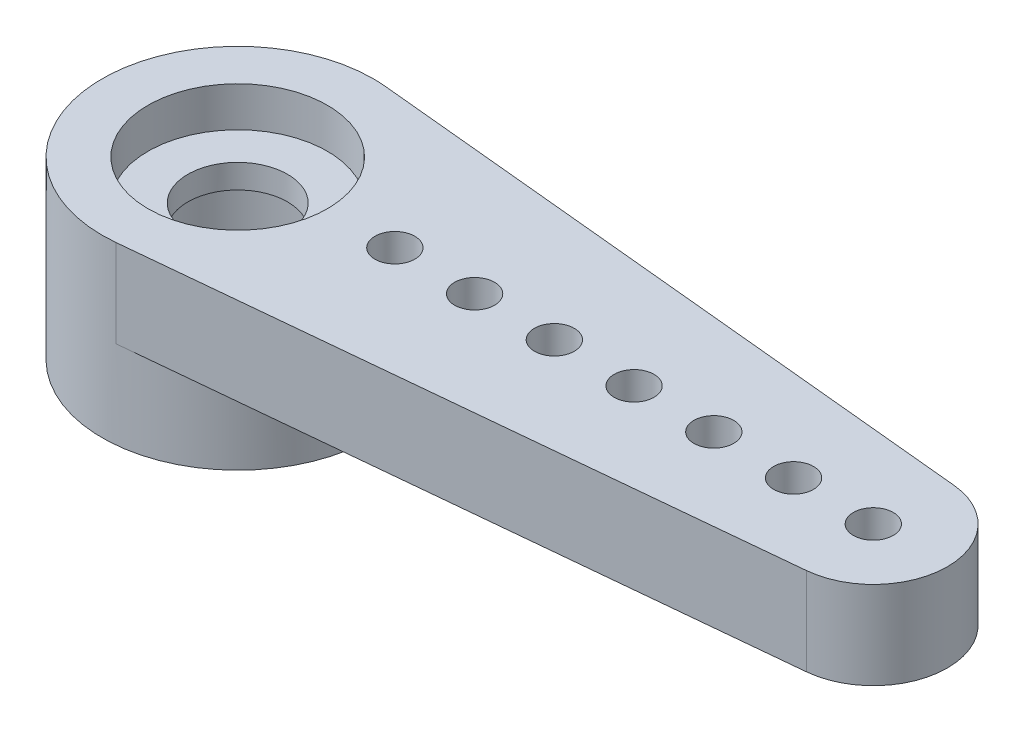
ISO-10303-21;
HEADER;
FILE_DESCRIPTION(('STEP AP214'),'2;1');
FILE_NAME('part.step','',(''),(''),'','','');
FILE_SCHEMA(('AUTOMOTIVE_DESIGN { 1 0 10303 214 1 1 1 1 }'));
ENDSEC;
DATA;
#1=APPLICATION_CONTEXT('core data for automotive mechanical design processes');
#2=APPLICATION_PROTOCOL_DEFINITION('international standard','automotive_design',2000,#1);
#3=PRODUCT_CONTEXT('',#1,'mechanical');
#4=PRODUCT('Part','Part','',(#3));
#5=PRODUCT_RELATED_PRODUCT_CATEGORY('part','',(#4));
#6=PRODUCT_DEFINITION_FORMATION('','',#4);
#7=PRODUCT_DEFINITION_CONTEXT('part definition',#1,'design');
#8=PRODUCT_DEFINITION('design','',#6,#7);
#9=PRODUCT_DEFINITION_SHAPE('','',#8);
#10=(LENGTH_UNIT() NAMED_UNIT(*) SI_UNIT(.MILLI.,.METRE.));
#11=(NAMED_UNIT(*) PLANE_ANGLE_UNIT() SI_UNIT($,.RADIAN.));
#12=(NAMED_UNIT(*) SI_UNIT($,.STERADIAN.) SOLID_ANGLE_UNIT());
#13=UNCERTAINTY_MEASURE_WITH_UNIT(LENGTH_MEASURE(1.E-05),#10,'distance_accuracy_value','');
#14=(GEOMETRIC_REPRESENTATION_CONTEXT(3) GLOBAL_UNCERTAINTY_ASSIGNED_CONTEXT((#13)) GLOBAL_UNIT_ASSIGNED_CONTEXT((#10,
#11,#12)) REPRESENTATION_CONTEXT('',''));
#15=CARTESIAN_POINT('',(0.,0.,0.));
#16=DIRECTION('',(0.,0.,1.));
#17=DIRECTION('',(1.,0.,0.));
#18=AXIS2_PLACEMENT_3D('',#15,#16,#17);
#19=CARTESIAN_POINT('',(0.,2.2,0.));
#20=DIRECTION('',(0.,1.,0.));
#21=DIRECTION('',(0.,0.,1.));
#22=AXIS2_PLACEMENT_3D('',#19,#20,#21);
#23=CYLINDRICAL_SURFACE('',#22,1.24999999999999);
#24=CARTESIAN_POINT('',(0.,0.6,0.));
#25=DIRECTION('',(0.,-1.,0.));
#26=DIRECTION('',(0.,0.,-1.));
#27=AXIS2_PLACEMENT_3D('',#24,#25,#26);
#28=CIRCLE('',#27,1.24999999999999);
#29=CARTESIAN_POINT('',(0.,0.6,-1.24999999999999));
#30=VERTEX_POINT('',#29);
#31=EDGE_CURVE('E108',#30,#30,#28,.T.);
#32=ORIENTED_EDGE('',*,*,#31,.T.);
#33=EDGE_LOOP('',(#32));
#34=FACE_BOUND('',#33,.T.);
#35=CARTESIAN_POINT('',(0.,1.2,0.));
#36=DIRECTION('',(0.,1.,0.));
#37=DIRECTION('',(0.,0.,1.));
#38=AXIS2_PLACEMENT_3D('',#35,#36,#37);
#39=CIRCLE('',#38,1.24999999999999);
#40=CARTESIAN_POINT('',(0.,1.2,1.24999999999999));
#41=VERTEX_POINT('',#40);
#42=EDGE_CURVE('E38',#41,#41,#39,.F.);
#43=ORIENTED_EDGE('',*,*,#42,.F.);
#44=EDGE_LOOP('',(#43));
#45=FACE_BOUND('',#44,.T.);
#46=ADVANCED_FACE('F34',(#34,#45),#23,.F.);
#47=CARTESIAN_POINT('',(0.,0.,0.));
#48=DIRECTION('',(0.,1.,0.));
#49=DIRECTION('',(0.,0.,1.));
#50=AXIS2_PLACEMENT_3D('',#47,#48,#49);
#51=PLANE('',#50);
#52=CARTESIAN_POINT('',(15.9412919182616,0.,0.));
#53=DIRECTION('',(0.,-1.,0.));
#54=DIRECTION('',(0.,0.,-1.));
#55=AXIS2_PLACEMENT_3D('',#52,#53,#54);
#56=CIRCLE('',#55,0.5);
#57=CARTESIAN_POINT('',(15.9412919182616,0.,-0.5));
#58=VERTEX_POINT('',#57);
#59=EDGE_CURVE('E220',#58,#58,#56,.T.);
#60=ORIENTED_EDGE('',*,*,#59,.F.);
#61=EDGE_LOOP('',(#60));
#62=FACE_BOUND('',#61,.T.);
#63=CARTESIAN_POINT('',(13.9412919182616,0.,0.));
#64=DIRECTION('',(0.,-1.,0.));
#65=DIRECTION('',(0.,0.,-1.));
#66=AXIS2_PLACEMENT_3D('',#63,#64,#65);
#67=CIRCLE('',#66,0.5);
#68=CARTESIAN_POINT('',(13.9412919182616,0.,-0.5));
#69=VERTEX_POINT('',#68);
#70=EDGE_CURVE('E216',#69,#69,#67,.T.);
#71=ORIENTED_EDGE('',*,*,#70,.F.);
#72=EDGE_LOOP('',(#71));
#73=FACE_BOUND('',#72,.T.);
#74=CARTESIAN_POINT('',(11.9412919182616,0.,0.));
#75=DIRECTION('',(0.,-1.,0.));
#76=DIRECTION('',(0.,0.,-1.));
#77=AXIS2_PLACEMENT_3D('',#74,#75,#76);
#78=CIRCLE('',#77,0.5);
#79=CARTESIAN_POINT('',(11.9412919182616,0.,-0.5));
#80=VERTEX_POINT('',#79);
#81=EDGE_CURVE('E212',#80,#80,#78,.T.);
#82=ORIENTED_EDGE('',*,*,#81,.F.);
#83=EDGE_LOOP('',(#82));
#84=FACE_BOUND('',#83,.T.);
#85=CARTESIAN_POINT('',(9.94129191826159,0.,0.));
#86=DIRECTION('',(0.,-1.,0.));
#87=DIRECTION('',(0.,0.,-1.));
#88=AXIS2_PLACEMENT_3D('',#85,#86,#87);
#89=CIRCLE('',#88,0.5);
#90=CARTESIAN_POINT('',(9.94129191826159,0.,-0.5));
#91=VERTEX_POINT('',#90);
#92=EDGE_CURVE('E208',#91,#91,#89,.T.);
#93=ORIENTED_EDGE('',*,*,#92,.F.);
#94=EDGE_LOOP('',(#93));
#95=FACE_BOUND('',#94,.T.);
#96=CARTESIAN_POINT('',(7.94129191826159,0.,0.));
#97=DIRECTION('',(0.,-1.,0.));
#98=DIRECTION('',(0.,0.,-1.));
#99=AXIS2_PLACEMENT_3D('',#96,#97,#98);
#100=CIRCLE('',#99,0.5);
#101=CARTESIAN_POINT('',(7.94129191826159,0.,-0.5));
#102=VERTEX_POINT('',#101);
#103=EDGE_CURVE('E204',#102,#102,#100,.T.);
#104=ORIENTED_EDGE('',*,*,#103,.F.);
#105=EDGE_LOOP('',(#104));
#106=FACE_BOUND('',#105,.T.);
#107=CARTESIAN_POINT('',(5.94129191826159,0.,0.));
#108=DIRECTION('',(0.,-1.,0.));
#109=DIRECTION('',(0.,0.,-1.));
#110=AXIS2_PLACEMENT_3D('',#107,#108,#109);
#111=CIRCLE('',#110,0.5);
#112=CARTESIAN_POINT('',(5.94129191826159,0.,-0.5));
#113=VERTEX_POINT('',#112);
#114=EDGE_CURVE('E199',#113,#113,#111,.T.);
#115=ORIENTED_EDGE('',*,*,#114,.F.);
#116=EDGE_LOOP('',(#115));
#117=FACE_BOUND('',#116,.T.);
#118=CARTESIAN_POINT('',(3.94129191826159,0.,0.));
#119=DIRECTION('',(0.,-1.,0.));
#120=DIRECTION('',(0.,0.,-1.));
#121=AXIS2_PLACEMENT_3D('',#118,#119,#120);
#122=CIRCLE('',#121,0.5);
#123=CARTESIAN_POINT('',(3.94129191826159,0.,-0.5));
#124=VERTEX_POINT('',#123);
#125=EDGE_CURVE('E117',#124,#124,#122,.T.);
#126=ORIENTED_EDGE('',*,*,#125,.F.);
#127=EDGE_LOOP('',(#126));
#128=FACE_BOUND('',#127,.T.);
#129=CARTESIAN_POINT('',(0.,0.,0.));
#130=DIRECTION('',(0.,-1.,0.));
#131=DIRECTION('',(0.,0.,-1.));
#132=AXIS2_PLACEMENT_3D('',#129,#130,#131);
#133=CIRCLE('',#132,3.4);
#134=CARTESIAN_POINT('',(0.328730729539321,0.,-3.38407093711945));
#135=VERTEX_POINT('',#134);
#136=CARTESIAN_POINT('',(0.328730729539321,0.,3.38407093711945));
#137=VERTEX_POINT('',#136);
#138=EDGE_CURVE('E84',#135,#137,#133,.T.);
#139=ORIENTED_EDGE('',*,*,#138,.F.);
#140=DIRECTION('',(-0.995314981505722,0.,-0.0966855086880355));
#141=VECTOR('',#140,1.);
#142=CARTESIAN_POINT('',(0.328730729539321,0.,-3.38407093711945));
#143=LINE('',#142,#141);
#144=CARTESIAN_POINT('',(16.121002054647,0.,-1.85));
#145=VERTEX_POINT('',#144);
#146=EDGE_CURVE('E87',#145,#135,#143,.T.);
#147=ORIENTED_EDGE('',*,*,#146,.F.);
#148=CARTESIAN_POINT('',(15.9412919182616,0.,0.));
#149=DIRECTION('',(0.,1.,0.));
#150=DIRECTION('',(0.,0.,-1.));
#151=AXIS2_PLACEMENT_3D('',#148,#149,#150);
#152=CIRCLE('',#151,1.85870808173841);
#153=CARTESIAN_POINT('',(16.121002054647,0.,1.85));
#154=VERTEX_POINT('',#153);
#155=EDGE_CURVE('E74',#154,#145,#152,.T.);
#156=ORIENTED_EDGE('',*,*,#155,.F.);
#157=DIRECTION('',(0.995314981505722,0.,-0.0966855086880355));
#158=VECTOR('',#157,1.);
#159=CARTESIAN_POINT('',(0.328730729539321,0.,3.38407093711945));
#160=LINE('',#159,#158);
#161=EDGE_CURVE('E67',#137,#154,#160,.T.);
#162=ORIENTED_EDGE('',*,*,#161,.F.);
#163=EDGE_LOOP('',(#139,#147,#156,#162));
#164=FACE_BOUND('',#163,.T.);
#165=ADVANCED_FACE('F86',(#62,#73,#84,#95,#106,#117,#128,#164),#51,.F.);
#166=CARTESIAN_POINT('',(0.,2.2,0.));
#167=DIRECTION('',(0.,-1.,0.));
#168=DIRECTION('',(0.,0.,-1.));
#169=AXIS2_PLACEMENT_3D('',#166,#167,#168);
#170=CYLINDRICAL_SURFACE('',#169,3.4);
#171=DIRECTION('',(0.,-1.,0.));
#172=VECTOR('',#171,1.);
#173=CARTESIAN_POINT('',(0.328730729539321,2.2,-3.38407093711945));
#174=LINE('',#173,#172);
#175=CARTESIAN_POINT('',(0.328730729539321,2.2,-3.38407093711945));
#176=VERTEX_POINT('',#175);
#177=EDGE_CURVE('E96',#176,#135,#174,.T.);
#178=ORIENTED_EDGE('',*,*,#177,.T.);
#179=ORIENTED_EDGE('',*,*,#138,.T.);
#180=DIRECTION('',(0.,-1.,0.));
#181=VECTOR('',#180,1.);
#182=CARTESIAN_POINT('',(0.328730729539321,2.2,3.38407093711945));
#183=LINE('',#182,#181);
#184=CARTESIAN_POINT('',(0.328730729539321,2.2,3.38407093711945));
#185=VERTEX_POINT('',#184);
#186=EDGE_CURVE('E11',#185,#137,#183,.T.);
#187=ORIENTED_EDGE('',*,*,#186,.F.);
#188=CARTESIAN_POINT('',(0.,2.2,0.));
#189=DIRECTION('',(0.,1.,0.));
#190=DIRECTION('',(0.,0.,1.));
#191=AXIS2_PLACEMENT_3D('',#188,#189,#190);
#192=CIRCLE('',#191,3.4);
#193=EDGE_CURVE('E99',#176,#185,#192,.T.);
#194=ORIENTED_EDGE('',*,*,#193,.F.);
#195=EDGE_LOOP('',(#178,#179,#187,#194));
#196=FACE_BOUND('',#195,.T.);
#197=CARTESIAN_POINT('',(0.,-2.2,0.));
#198=DIRECTION('',(0.,-1.,0.));
#199=DIRECTION('',(0.,0.,-1.));
#200=AXIS2_PLACEMENT_3D('',#197,#198,#199);
#201=CIRCLE('',#200,3.4);
#202=CARTESIAN_POINT('',(0.,-2.2,-3.4));
#203=VERTEX_POINT('',#202);
#204=EDGE_CURVE('E91',#203,#203,#201,.T.);
#205=ORIENTED_EDGE('',*,*,#204,.F.);
#206=EDGE_LOOP('',(#205));
#207=FACE_BOUND('',#206,.T.);
#208=ADVANCED_FACE('F36',(#196,#207),#170,.T.);
#209=CARTESIAN_POINT('',(0.328730729539321,2.2,3.38407093711945));
#210=DIRECTION('',(-0.0966855086880355,0.,-0.995314981505722));
#211=DIRECTION('',(-0.995314981505722,0.,0.0966855086880355));
#212=AXIS2_PLACEMENT_3D('',#209,#210,#211);
#213=PLANE('',#212);
#214=ORIENTED_EDGE('',*,*,#161,.T.);
#215=DIRECTION('',(0.,-1.,0.));
#216=VECTOR('',#215,1.);
#217=CARTESIAN_POINT('',(16.121002054647,2.2,1.85));
#218=LINE('',#217,#216);
#219=CARTESIAN_POINT('',(16.121002054647,2.2,1.85));
#220=VERTEX_POINT('',#219);
#221=EDGE_CURVE('E44',#220,#154,#218,.T.);
#222=ORIENTED_EDGE('',*,*,#221,.F.);
#223=DIRECTION('',(0.995314981505722,0.,-0.0966855086880355));
#224=VECTOR('',#223,1.);
#225=CARTESIAN_POINT('',(0.328730729539321,2.2,3.38407093711945));
#226=LINE('',#225,#224);
#227=EDGE_CURVE('E79',#185,#220,#226,.T.);
#228=ORIENTED_EDGE('',*,*,#227,.F.);
#229=ORIENTED_EDGE('',*,*,#186,.T.);
#230=EDGE_LOOP('',(#214,#222,#228,#229));
#231=FACE_BOUND('',#230,.T.);
#232=ADVANCED_FACE('F137',(#231),#213,.F.);
#233=CARTESIAN_POINT('',(15.9412919182616,2.2,0.));
#234=DIRECTION('',(0.,-1.,0.));
#235=DIRECTION('',(0.,0.,-1.));
#236=AXIS2_PLACEMENT_3D('',#233,#234,#235);
#237=CYLINDRICAL_SURFACE('',#236,1.85870808173841);
#238=ORIENTED_EDGE('',*,*,#155,.T.);
#239=DIRECTION('',(0.,-1.,0.));
#240=VECTOR('',#239,1.);
#241=CARTESIAN_POINT('',(16.121002054647,2.2,-1.85));
#242=LINE('',#241,#240);
#243=CARTESIAN_POINT('',(16.121002054647,2.2,-1.85));
#244=VERTEX_POINT('',#243);
#245=EDGE_CURVE('E98',#244,#145,#242,.T.);
#246=ORIENTED_EDGE('',*,*,#245,.F.);
#247=CARTESIAN_POINT('',(15.9412919182616,2.2,0.));
#248=DIRECTION('',(0.,1.,0.));
#249=DIRECTION('',(0.,0.,-1.));
#250=AXIS2_PLACEMENT_3D('',#247,#248,#249);
#251=CIRCLE('',#250,1.85870808173841);
#252=EDGE_CURVE('E104',#220,#244,#251,.T.);
#253=ORIENTED_EDGE('',*,*,#252,.F.);
#254=ORIENTED_EDGE('',*,*,#221,.T.);
#255=EDGE_LOOP('',(#238,#246,#253,#254));
#256=FACE_BOUND('',#255,.T.);
#257=ADVANCED_FACE('F135',(#256),#237,.T.);
#258=CARTESIAN_POINT('',(0.328730729539321,2.2,-3.38407093711945));
#259=DIRECTION('',(-0.0966855086880355,0.,0.995314981505722));
#260=DIRECTION('',(0.995314981505722,0.,0.0966855086880355));
#261=AXIS2_PLACEMENT_3D('',#258,#259,#260);
#262=PLANE('',#261);
#263=ORIENTED_EDGE('',*,*,#146,.T.);
#264=ORIENTED_EDGE('',*,*,#177,.F.);
#265=DIRECTION('',(-0.995314981505722,0.,-0.0966855086880355));
#266=VECTOR('',#265,1.);
#267=CARTESIAN_POINT('',(0.328730729539321,2.2,-3.38407093711945));
#268=LINE('',#267,#266);
#269=EDGE_CURVE('E53',#244,#176,#268,.T.);
#270=ORIENTED_EDGE('',*,*,#269,.F.);
#271=ORIENTED_EDGE('',*,*,#245,.T.);
#272=EDGE_LOOP('',(#263,#264,#270,#271));
#273=FACE_BOUND('',#272,.T.);
#274=ADVANCED_FACE('F95',(#273),#262,.F.);
#275=CARTESIAN_POINT('',(0.,2.2,0.));
#276=DIRECTION('',(0.,1.,0.));
#277=DIRECTION('',(0.,0.,1.));
#278=AXIS2_PLACEMENT_3D('',#275,#276,#277);
#279=PLANE('',#278);
#280=CARTESIAN_POINT('',(0.,2.2,0.));
#281=DIRECTION('',(0.,1.,0.));
#282=DIRECTION('',(0.,0.,1.));
#283=AXIS2_PLACEMENT_3D('',#280,#281,#282);
#284=CIRCLE('',#283,2.25);
#285=CARTESIAN_POINT('',(0.,2.2,2.25));
#286=VERTEX_POINT('',#285);
#287=EDGE_CURVE('E175',#286,#286,#284,.T.);
#288=ORIENTED_EDGE('',*,*,#287,.F.);
#289=EDGE_LOOP('',(#288));
#290=FACE_BOUND('',#289,.T.);
#291=CARTESIAN_POINT('',(15.9412919182616,2.2,0.));
#292=DIRECTION('',(0.,-1.,0.));
#293=DIRECTION('',(0.,0.,-1.));
#294=AXIS2_PLACEMENT_3D('',#291,#292,#293);
#295=CIRCLE('',#294,0.5);
#296=CARTESIAN_POINT('',(15.9412919182616,2.2,-0.5));
#297=VERTEX_POINT('',#296);
#298=EDGE_CURVE('E179',#297,#297,#295,.T.);
#299=ORIENTED_EDGE('',*,*,#298,.T.);
#300=EDGE_LOOP('',(#299));
#301=FACE_BOUND('',#300,.T.);
#302=CARTESIAN_POINT('',(13.9412919182616,2.2,0.));
#303=DIRECTION('',(0.,-1.,0.));
#304=DIRECTION('',(0.,0.,-1.));
#305=AXIS2_PLACEMENT_3D('',#302,#303,#304);
#306=CIRCLE('',#305,0.499999999999999);
#307=CARTESIAN_POINT('',(13.9412919182616,2.2,-0.499999999999999));
#308=VERTEX_POINT('',#307);
#309=EDGE_CURVE('E183',#308,#308,#306,.T.);
#310=ORIENTED_EDGE('',*,*,#309,.T.);
#311=EDGE_LOOP('',(#310));
#312=FACE_BOUND('',#311,.T.);
#313=CARTESIAN_POINT('',(11.9412919182616,2.2,0.));
#314=DIRECTION('',(0.,-1.,0.));
#315=DIRECTION('',(0.,0.,-1.));
#316=AXIS2_PLACEMENT_3D('',#313,#314,#315);
#317=CIRCLE('',#316,0.499999999999999);
#318=CARTESIAN_POINT('',(11.9412919182616,2.2,-0.499999999999999));
#319=VERTEX_POINT('',#318);
#320=EDGE_CURVE('E187',#319,#319,#317,.T.);
#321=ORIENTED_EDGE('',*,*,#320,.T.);
#322=EDGE_LOOP('',(#321));
#323=FACE_BOUND('',#322,.T.);
#324=CARTESIAN_POINT('',(9.94129191826159,2.2,0.));
#325=DIRECTION('',(0.,-1.,0.));
#326=DIRECTION('',(0.,0.,-1.));
#327=AXIS2_PLACEMENT_3D('',#324,#325,#326);
#328=CIRCLE('',#327,0.499999999999999);
#329=CARTESIAN_POINT('',(9.94129191826159,2.2,-0.499999999999999));
#330=VERTEX_POINT('',#329);
#331=EDGE_CURVE('E191',#330,#330,#328,.T.);
#332=ORIENTED_EDGE('',*,*,#331,.T.);
#333=EDGE_LOOP('',(#332));
#334=FACE_BOUND('',#333,.T.);
#335=CARTESIAN_POINT('',(7.94129191826159,2.2,0.));
#336=DIRECTION('',(0.,-1.,0.));
#337=DIRECTION('',(0.,0.,-1.));
#338=AXIS2_PLACEMENT_3D('',#335,#336,#337);
#339=CIRCLE('',#338,0.499999999999999);
#340=CARTESIAN_POINT('',(7.94129191826159,2.2,-0.499999999999999));
#341=VERTEX_POINT('',#340);
#342=EDGE_CURVE('E195',#341,#341,#339,.T.);
#343=ORIENTED_EDGE('',*,*,#342,.T.);
#344=EDGE_LOOP('',(#343));
#345=FACE_BOUND('',#344,.T.);
#346=CARTESIAN_POINT('',(5.94129191826159,2.2,0.));
#347=DIRECTION('',(0.,-1.,0.));
#348=DIRECTION('',(0.,0.,-1.));
#349=AXIS2_PLACEMENT_3D('',#346,#347,#348);
#350=CIRCLE('',#349,0.499999999999999);
#351=CARTESIAN_POINT('',(5.94129191826159,2.2,-0.499999999999999));
#352=VERTEX_POINT('',#351);
#353=EDGE_CURVE('E122',#352,#352,#350,.T.);
#354=ORIENTED_EDGE('',*,*,#353,.T.);
#355=EDGE_LOOP('',(#354));
#356=FACE_BOUND('',#355,.T.);
#357=CARTESIAN_POINT('',(3.94129191826159,2.2,0.));
#358=DIRECTION('',(0.,-1.,0.));
#359=DIRECTION('',(0.,0.,-1.));
#360=AXIS2_PLACEMENT_3D('',#357,#358,#359);
#361=CIRCLE('',#360,0.499999999999999);
#362=CARTESIAN_POINT('',(3.94129191826159,2.2,-0.499999999999999));
#363=VERTEX_POINT('',#362);
#364=EDGE_CURVE('E111',#363,#363,#361,.T.);
#365=ORIENTED_EDGE('',*,*,#364,.T.);
#366=EDGE_LOOP('',(#365));
#367=FACE_BOUND('',#366,.T.);
#368=ORIENTED_EDGE('',*,*,#193,.T.);
#369=ORIENTED_EDGE('',*,*,#227,.T.);
#370=ORIENTED_EDGE('',*,*,#252,.T.);
#371=ORIENTED_EDGE('',*,*,#269,.T.);
#372=EDGE_LOOP('',(#368,#369,#370,#371));
#373=FACE_BOUND('',#372,.T.);
#374=ADVANCED_FACE('F134',(#290,#301,#312,#323,#334,#345,#356,#367,#373),#279,.T.);
#375=CARTESIAN_POINT('',(0.,-2.2,0.));
#376=DIRECTION('',(0.,-1.,0.));
#377=DIRECTION('',(0.,0.,-1.));
#378=AXIS2_PLACEMENT_3D('',#375,#376,#377);
#379=PLANE('',#378);
#380=CARTESIAN_POINT('',(0.,-2.2,0.));
#381=DIRECTION('',(0.,-1.,0.));
#382=DIRECTION('',(0.,0.,-1.));
#383=AXIS2_PLACEMENT_3D('',#380,#381,#382);
#384=CIRCLE('',#383,2.1);
#385=CARTESIAN_POINT('',(0.,-2.2,-2.1));
#386=VERTEX_POINT('',#385);
#387=EDGE_CURVE('E110',#386,#386,#384,.T.);
#388=ORIENTED_EDGE('',*,*,#387,.F.);
#389=EDGE_LOOP('',(#388));
#390=FACE_BOUND('',#389,.T.);
#391=ORIENTED_EDGE('',*,*,#204,.T.);
#392=EDGE_LOOP('',(#391));
#393=FACE_BOUND('',#392,.T.);
#394=ADVANCED_FACE('F163',(#390,#393),#379,.T.);
#395=CARTESIAN_POINT('',(0.,0.6,0.));
#396=DIRECTION('',(0.,-1.,0.));
#397=DIRECTION('',(0.,0.,-1.));
#398=AXIS2_PLACEMENT_3D('',#395,#396,#397);
#399=CYLINDRICAL_SURFACE('',#398,2.1);
#400=CARTESIAN_POINT('',(0.,0.6,0.));
#401=DIRECTION('',(0.,-1.,0.));
#402=DIRECTION('',(0.,0.,-1.));
#403=AXIS2_PLACEMENT_3D('',#400,#401,#402);
#404=CIRCLE('',#403,2.1);
#405=CARTESIAN_POINT('',(0.,0.6,-2.1));
#406=VERTEX_POINT('',#405);
#407=EDGE_CURVE('E92',#406,#406,#404,.T.);
#408=ORIENTED_EDGE('',*,*,#407,.F.);
#409=EDGE_LOOP('',(#408));
#410=FACE_BOUND('',#409,.T.);
#411=ORIENTED_EDGE('',*,*,#387,.T.);
#412=EDGE_LOOP('',(#411));
#413=FACE_BOUND('',#412,.T.);
#414=ADVANCED_FACE('F159',(#410,#413),#399,.F.);
#415=CARTESIAN_POINT('',(0.,0.6,0.));
#416=DIRECTION('',(0.,-1.,0.));
#417=DIRECTION('',(0.,0.,-1.));
#418=AXIS2_PLACEMENT_3D('',#415,#416,#417);
#419=PLANE('',#418);
#420=ORIENTED_EDGE('',*,*,#31,.F.);
#421=EDGE_LOOP('',(#420));
#422=FACE_BOUND('',#421,.T.);
#423=ORIENTED_EDGE('',*,*,#407,.T.);
#424=EDGE_LOOP('',(#423));
#425=FACE_BOUND('',#424,.T.);
#426=ADVANCED_FACE('F156',(#422,#425),#419,.T.);
#427=CARTESIAN_POINT('',(3.94129191826159,0.,0.));
#428=DIRECTION('',(0.,-1.,0.));
#429=DIRECTION('',(0.,0.,-1.));
#430=AXIS2_PLACEMENT_3D('',#427,#428,#429);
#431=CYLINDRICAL_SURFACE('',#430,0.499999999999999);
#432=ORIENTED_EDGE('',*,*,#364,.F.);
#433=EDGE_LOOP('',(#432));
#434=FACE_BOUND('',#433,.T.);
#435=ORIENTED_EDGE('',*,*,#125,.T.);
#436=EDGE_LOOP('',(#435));
#437=FACE_BOUND('',#436,.T.);
#438=ADVANCED_FACE('F154',(#434,#437),#431,.F.);
#439=CARTESIAN_POINT('',(5.94129191826159,0.,0.));
#440=DIRECTION('',(0.,-1.,0.));
#441=DIRECTION('',(0.,0.,-1.));
#442=AXIS2_PLACEMENT_3D('',#439,#440,#441);
#443=CYLINDRICAL_SURFACE('',#442,0.499999999999999);
#444=ORIENTED_EDGE('',*,*,#353,.F.);
#445=EDGE_LOOP('',(#444));
#446=FACE_BOUND('',#445,.T.);
#447=ORIENTED_EDGE('',*,*,#114,.T.);
#448=EDGE_LOOP('',(#447));
#449=FACE_BOUND('',#448,.T.);
#450=ADVANCED_FACE('F259',(#446,#449),#443,.F.);
#451=CARTESIAN_POINT('',(7.94129191826159,0.,0.));
#452=DIRECTION('',(0.,-1.,0.));
#453=DIRECTION('',(0.,0.,-1.));
#454=AXIS2_PLACEMENT_3D('',#451,#452,#453);
#455=CYLINDRICAL_SURFACE('',#454,0.5);
#456=ORIENTED_EDGE('',*,*,#342,.F.);
#457=EDGE_LOOP('',(#456));
#458=FACE_BOUND('',#457,.T.);
#459=ORIENTED_EDGE('',*,*,#103,.T.);
#460=EDGE_LOOP('',(#459));
#461=FACE_BOUND('',#460,.T.);
#462=ADVANCED_FACE('F256',(#458,#461),#455,.F.);
#463=CARTESIAN_POINT('',(9.94129191826159,0.,0.));
#464=DIRECTION('',(0.,-1.,0.));
#465=DIRECTION('',(0.,0.,-1.));
#466=AXIS2_PLACEMENT_3D('',#463,#464,#465);
#467=CYLINDRICAL_SURFACE('',#466,0.5);
#468=ORIENTED_EDGE('',*,*,#331,.F.);
#469=EDGE_LOOP('',(#468));
#470=FACE_BOUND('',#469,.T.);
#471=ORIENTED_EDGE('',*,*,#92,.T.);
#472=EDGE_LOOP('',(#471));
#473=FACE_BOUND('',#472,.T.);
#474=ADVANCED_FACE('F252',(#470,#473),#467,.F.);
#475=CARTESIAN_POINT('',(11.9412919182616,0.,0.));
#476=DIRECTION('',(0.,-1.,0.));
#477=DIRECTION('',(0.,0.,-1.));
#478=AXIS2_PLACEMENT_3D('',#475,#476,#477);
#479=CYLINDRICAL_SURFACE('',#478,0.5);
#480=ORIENTED_EDGE('',*,*,#320,.F.);
#481=EDGE_LOOP('',(#480));
#482=FACE_BOUND('',#481,.T.);
#483=ORIENTED_EDGE('',*,*,#81,.T.);
#484=EDGE_LOOP('',(#483));
#485=FACE_BOUND('',#484,.T.);
#486=ADVANCED_FACE('F248',(#482,#485),#479,.F.);
#487=CARTESIAN_POINT('',(13.9412919182616,0.,0.));
#488=DIRECTION('',(0.,-1.,0.));
#489=DIRECTION('',(0.,0.,-1.));
#490=AXIS2_PLACEMENT_3D('',#487,#488,#489);
#491=CYLINDRICAL_SURFACE('',#490,0.5);
#492=ORIENTED_EDGE('',*,*,#309,.F.);
#493=EDGE_LOOP('',(#492));
#494=FACE_BOUND('',#493,.T.);
#495=ORIENTED_EDGE('',*,*,#70,.T.);
#496=EDGE_LOOP('',(#495));
#497=FACE_BOUND('',#496,.T.);
#498=ADVANCED_FACE('F242',(#494,#497),#491,.F.);
#499=CARTESIAN_POINT('',(15.9412919182616,0.,0.));
#500=DIRECTION('',(0.,-1.,0.));
#501=DIRECTION('',(0.,0.,-1.));
#502=AXIS2_PLACEMENT_3D('',#499,#500,#501);
#503=CYLINDRICAL_SURFACE('',#502,0.5);
#504=ORIENTED_EDGE('',*,*,#298,.F.);
#505=EDGE_LOOP('',(#504));
#506=FACE_BOUND('',#505,.T.);
#507=ORIENTED_EDGE('',*,*,#59,.T.);
#508=EDGE_LOOP('',(#507));
#509=FACE_BOUND('',#508,.T.);
#510=ADVANCED_FACE('F234',(#506,#509),#503,.F.);
#511=CARTESIAN_POINT('',(0.,1.2,0.));
#512=DIRECTION('',(0.,1.,0.));
#513=DIRECTION('',(0.,0.,1.));
#514=AXIS2_PLACEMENT_3D('',#511,#512,#513);
#515=PLANE('',#514);
#516=CARTESIAN_POINT('',(0.,1.2,0.));
#517=DIRECTION('',(0.,1.,0.));
#518=DIRECTION('',(0.,0.,1.));
#519=AXIS2_PLACEMENT_3D('',#516,#517,#518);
#520=CIRCLE('',#519,2.25);
#521=CARTESIAN_POINT('',(0.,1.2,2.25));
#522=VERTEX_POINT('',#521);
#523=EDGE_CURVE('E224',#522,#522,#520,.T.);
#524=ORIENTED_EDGE('',*,*,#523,.T.);
#525=EDGE_LOOP('',(#524));
#526=FACE_BOUND('',#525,.T.);
#527=ORIENTED_EDGE('',*,*,#42,.T.);
#528=EDGE_LOOP('',(#527));
#529=FACE_BOUND('',#528,.T.);
#530=ADVANCED_FACE('F231',(#526,#529),#515,.T.);
#531=CARTESIAN_POINT('',(0.,1.2,0.));
#532=DIRECTION('',(0.,1.,0.));
#533=DIRECTION('',(0.,0.,1.));
#534=AXIS2_PLACEMENT_3D('',#531,#532,#533);
#535=CYLINDRICAL_SURFACE('',#534,2.25);
#536=ORIENTED_EDGE('',*,*,#523,.F.);
#537=EDGE_LOOP('',(#536));
#538=FACE_BOUND('',#537,.T.);
#539=ORIENTED_EDGE('',*,*,#287,.T.);
#540=EDGE_LOOP('',(#539));
#541=FACE_BOUND('',#540,.T.);
#542=ADVANCED_FACE('F233',(#538,#541),#535,.F.);
#543=CLOSED_SHELL('',(#46,#165,#208,#232,#257,#274,#374,#394,#414,#426,#438,#450,#462,#474,#486,
#498,#510,#530,#542));
#544=MANIFOLD_SOLID_BREP('B2',#543);
#545=ADVANCED_BREP_SHAPE_REPRESENTATION('',(#18,#544),#14);
#546=SHAPE_DEFINITION_REPRESENTATION(#9,#545);
ENDSEC;
END-ISO-10303-21;
